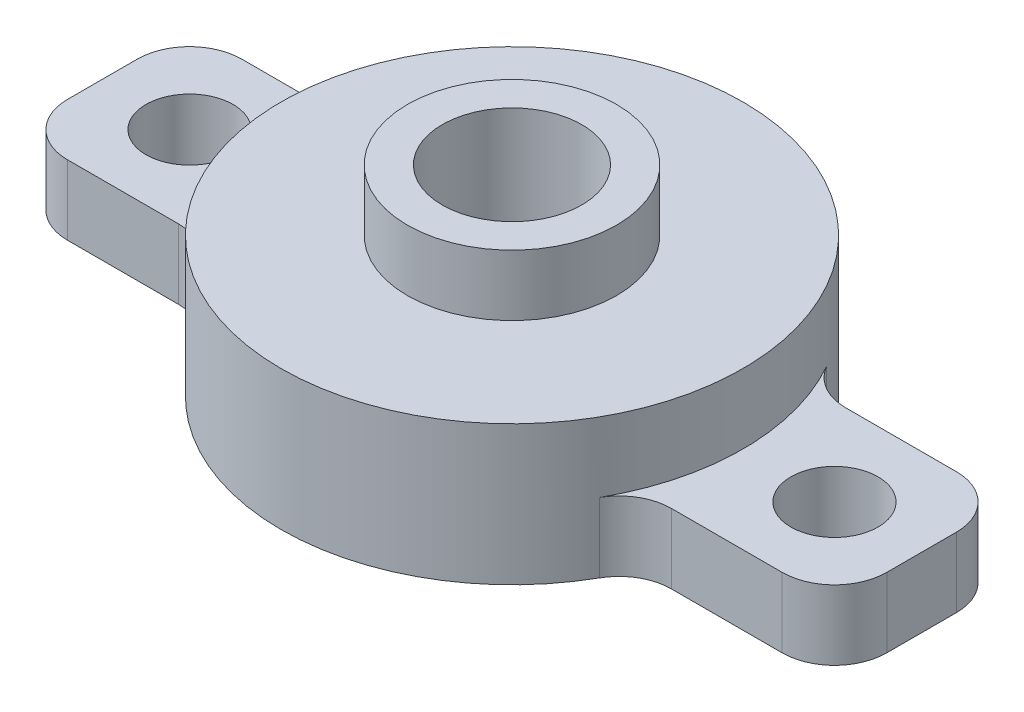
ISO-10303-21;
HEADER;
FILE_DESCRIPTION(('STEP AP214'),'2;1');
FILE_NAME('part.step','',(''),(''),'','','');
FILE_SCHEMA(('AUTOMOTIVE_DESIGN { 1 0 10303 214 1 1 1 1 }'));
ENDSEC;
DATA;
#1=APPLICATION_CONTEXT('core data for automotive mechanical design processes');
#2=APPLICATION_PROTOCOL_DEFINITION('international standard','automotive_design',2000,#1);
#3=PRODUCT_CONTEXT('',#1,'mechanical');
#4=PRODUCT('Part','Part','',(#3));
#5=PRODUCT_RELATED_PRODUCT_CATEGORY('part','',(#4));
#6=PRODUCT_DEFINITION_FORMATION('','',#4);
#7=PRODUCT_DEFINITION_CONTEXT('part definition',#1,'design');
#8=PRODUCT_DEFINITION('design','',#6,#7);
#9=PRODUCT_DEFINITION_SHAPE('','',#8);
#10=(LENGTH_UNIT() NAMED_UNIT(*) SI_UNIT(.MILLI.,.METRE.));
#11=(NAMED_UNIT(*) PLANE_ANGLE_UNIT() SI_UNIT($,.RADIAN.));
#12=(NAMED_UNIT(*) SI_UNIT($,.STERADIAN.) SOLID_ANGLE_UNIT());
#13=UNCERTAINTY_MEASURE_WITH_UNIT(LENGTH_MEASURE(1.E-05),#10,'distance_accuracy_value','');
#14=(GEOMETRIC_REPRESENTATION_CONTEXT(3) GLOBAL_UNCERTAINTY_ASSIGNED_CONTEXT((#13)) GLOBAL_UNIT_ASSIGNED_CONTEXT((#10,
#11,#12)) REPRESENTATION_CONTEXT('',''));
#15=CARTESIAN_POINT('',(0.,0.,0.));
#16=DIRECTION('',(0.,0.,1.));
#17=DIRECTION('',(1.,0.,0.));
#18=AXIS2_PLACEMENT_3D('',#15,#16,#17);
#19=CARTESIAN_POINT('',(0.,4.,0.));
#20=DIRECTION('',(0.,1.,0.));
#21=DIRECTION('',(0.,0.,1.));
#22=AXIS2_PLACEMENT_3D('',#19,#20,#21);
#23=PLANE('',#22);
#24=CARTESIAN_POINT('',(18.5,4.,0.));
#25=DIRECTION('',(0.,1.,0.));
#26=DIRECTION('',(0.,0.,1.));
#27=AXIS2_PLACEMENT_3D('',#24,#25,#26);
#28=CIRCLE('',#27,2.50000000000001);
#29=CARTESIAN_POINT('',(18.5,4.,2.50000000000001));
#30=VERTEX_POINT('',#29);
#31=EDGE_CURVE('E313',#30,#30,#28,.T.);
#32=ORIENTED_EDGE('',*,*,#31,.F.);
#33=EDGE_LOOP('',(#32));
#34=FACE_BOUND('',#33,.T.);
#35=DIRECTION('',(0.,0.,1.));
#36=VECTOR('',#35,1.);
#37=CARTESIAN_POINT('',(23.5,4.,0.));
#38=LINE('',#37,#36);
#39=CARTESIAN_POINT('',(23.5,4.,-2.));
#40=VERTEX_POINT('',#39);
#41=CARTESIAN_POINT('',(23.5,4.,2.));
#42=VERTEX_POINT('',#41);
#43=EDGE_CURVE('E269',#40,#42,#38,.T.);
#44=ORIENTED_EDGE('',*,*,#43,.F.);
#45=CARTESIAN_POINT('',(20.5,4.,-2.));
#46=DIRECTION('',(0.,1.,0.));
#47=DIRECTION('',(0.,0.,1.));
#48=AXIS2_PLACEMENT_3D('',#45,#46,#47);
#49=CIRCLE('',#48,3.);
#50=CARTESIAN_POINT('',(20.5,4.,-5.));
#51=VERTEX_POINT('',#50);
#52=EDGE_CURVE('E227',#40,#51,#49,.T.);
#53=ORIENTED_EDGE('',*,*,#52,.T.);
#54=DIRECTION('',(1.,0.,0.));
#55=VECTOR('',#54,1.);
#56=CARTESIAN_POINT('',(0.,4.,-5.));
#57=LINE('',#56,#55);
#58=CARTESIAN_POINT('',(14.1443451598156,4.,-5.));
#59=VERTEX_POINT('',#58);
#60=EDGE_CURVE('E266',#59,#51,#57,.T.);
#61=ORIENTED_EDGE('',*,*,#60,.F.);
#62=CARTESIAN_POINT('',(14.1443451598156,4.,-8.));
#63=DIRECTION('',(0.,1.,0.));
#64=DIRECTION('',(0.,0.,1.));
#65=AXIS2_PLACEMENT_3D('',#62,#63,#64);
#66=CIRCLE('',#65,3.);
#67=CARTESIAN_POINT('',(11.5330814380035,4.,-6.52307692307692));
#68=VERTEX_POINT('',#67);
#69=EDGE_CURVE('E11',#59,#68,#66,.F.);
#70=ORIENTED_EDGE('',*,*,#69,.T.);
#71=CARTESIAN_POINT('',(0.,4.,0.));
#72=DIRECTION('',(0.,1.,0.));
#73=DIRECTION('',(0.,0.,1.));
#74=AXIS2_PLACEMENT_3D('',#71,#72,#73);
#75=CIRCLE('',#74,13.25);
#76=CARTESIAN_POINT('',(11.5330814380035,4.,6.52307692307692));
#77=VERTEX_POINT('',#76);
#78=EDGE_CURVE('E265',#77,#68,#75,.T.);
#79=ORIENTED_EDGE('',*,*,#78,.F.);
#80=CARTESIAN_POINT('',(14.1443451598156,4.,8.));
#81=DIRECTION('',(0.,1.,0.));
#82=DIRECTION('',(0.,0.,1.));
#83=AXIS2_PLACEMENT_3D('',#80,#81,#82);
#84=CIRCLE('',#83,3.);
#85=CARTESIAN_POINT('',(14.1443451598156,4.,5.));
#86=VERTEX_POINT('',#85);
#87=EDGE_CURVE('E246',#77,#86,#84,.F.);
#88=ORIENTED_EDGE('',*,*,#87,.T.);
#89=DIRECTION('',(1.,0.,0.));
#90=VECTOR('',#89,1.);
#91=CARTESIAN_POINT('',(0.,4.,5.));
#92=LINE('',#91,#90);
#93=CARTESIAN_POINT('',(20.5,4.,5.));
#94=VERTEX_POINT('',#93);
#95=EDGE_CURVE('E274',#86,#94,#92,.T.);
#96=ORIENTED_EDGE('',*,*,#95,.T.);
#97=CARTESIAN_POINT('',(20.5,4.,2.));
#98=DIRECTION('',(0.,1.,0.));
#99=DIRECTION('',(0.,0.,1.));
#100=AXIS2_PLACEMENT_3D('',#97,#98,#99);
#101=CIRCLE('',#100,3.);
#102=EDGE_CURVE('E225',#94,#42,#101,.T.);
#103=ORIENTED_EDGE('',*,*,#102,.T.);
#104=EDGE_LOOP('',(#44,#53,#61,#70,#79,#88,#96,#103));
#105=FACE_BOUND('',#104,.T.);
#106=ADVANCED_FACE('F41',(#34,#105),#23,.T.);
#107=CARTESIAN_POINT('',(0.,4.,5.));
#108=DIRECTION('',(0.,0.,-1.));
#109=DIRECTION('',(-1.,0.,0.));
#110=AXIS2_PLACEMENT_3D('',#107,#108,#109);
#111=PLANE('',#110);
#112=ORIENTED_EDGE('',*,*,#95,.F.);
#113=DIRECTION('',(0.,1.,0.));
#114=VECTOR('',#113,1.);
#115=CARTESIAN_POINT('',(14.1443451598156,0.,5.));
#116=LINE('',#115,#114);
#117=CARTESIAN_POINT('',(14.1443451598156,0.,5.));
#118=VERTEX_POINT('',#117);
#119=EDGE_CURVE('E208',#86,#118,#116,.F.);
#120=ORIENTED_EDGE('',*,*,#119,.T.);
#121=DIRECTION('',(1.,0.,0.));
#122=VECTOR('',#121,1.);
#123=CARTESIAN_POINT('',(0.,0.,5.));
#124=LINE('',#123,#122);
#125=CARTESIAN_POINT('',(20.5,0.,5.));
#126=VERTEX_POINT('',#125);
#127=EDGE_CURVE('E285',#118,#126,#124,.T.);
#128=ORIENTED_EDGE('',*,*,#127,.T.);
#129=DIRECTION('',(0.,-1.,0.));
#130=VECTOR('',#129,1.);
#131=CARTESIAN_POINT('',(20.5,4.,5.));
#132=LINE('',#131,#130);
#133=EDGE_CURVE('E206',#126,#94,#132,.F.);
#134=ORIENTED_EDGE('',*,*,#133,.T.);
#135=EDGE_LOOP('',(#112,#120,#128,#134));
#136=FACE_BOUND('',#135,.T.);
#137=ADVANCED_FACE('F343',(#136),#111,.F.);
#138=CARTESIAN_POINT('',(23.5,4.,0.));
#139=DIRECTION('',(1.,0.,0.));
#140=DIRECTION('',(0.,0.,-1.));
#141=AXIS2_PLACEMENT_3D('',#138,#139,#140);
#142=PLANE('',#141);
#143=DIRECTION('',(0.,0.,1.));
#144=VECTOR('',#143,1.);
#145=CARTESIAN_POINT('',(23.5,0.,0.));
#146=LINE('',#145,#144);
#147=CARTESIAN_POINT('',(23.5,0.,-2.));
#148=VERTEX_POINT('',#147);
#149=CARTESIAN_POINT('',(23.5,0.,2.));
#150=VERTEX_POINT('',#149);
#151=EDGE_CURVE('E259',#148,#150,#146,.T.);
#152=ORIENTED_EDGE('',*,*,#151,.F.);
#153=DIRECTION('',(0.,-1.,0.));
#154=VECTOR('',#153,1.);
#155=CARTESIAN_POINT('',(23.5,4.,-2.));
#156=LINE('',#155,#154);
#157=EDGE_CURVE('E223',#148,#40,#156,.F.);
#158=ORIENTED_EDGE('',*,*,#157,.T.);
#159=ORIENTED_EDGE('',*,*,#43,.T.);
#160=DIRECTION('',(0.,-1.,0.));
#161=VECTOR('',#160,1.);
#162=CARTESIAN_POINT('',(23.5,0.,2.));
#163=LINE('',#162,#161);
#164=EDGE_CURVE('E220',#42,#150,#163,.T.);
#165=ORIENTED_EDGE('',*,*,#164,.T.);
#166=EDGE_LOOP('',(#152,#158,#159,#165));
#167=FACE_BOUND('',#166,.T.);
#168=ADVANCED_FACE('F351',(#167),#142,.T.);
#169=CARTESIAN_POINT('',(0.,4.,-5.));
#170=DIRECTION('',(0.,0.,-1.));
#171=DIRECTION('',(-1.,0.,0.));
#172=AXIS2_PLACEMENT_3D('',#169,#170,#171);
#173=PLANE('',#172);
#174=DIRECTION('',(1.,0.,0.));
#175=VECTOR('',#174,1.);
#176=CARTESIAN_POINT('',(0.,0.,-5.));
#177=LINE('',#176,#175);
#178=CARTESIAN_POINT('',(14.1443451598156,0.,-5.));
#179=VERTEX_POINT('',#178);
#180=CARTESIAN_POINT('',(20.5,0.,-5.));
#181=VERTEX_POINT('',#180);
#182=EDGE_CURVE('E249',#179,#181,#177,.T.);
#183=ORIENTED_EDGE('',*,*,#182,.F.);
#184=DIRECTION('',(0.,-1.,0.));
#185=VECTOR('',#184,1.);
#186=CARTESIAN_POINT('',(14.1443451598156,4.,-5.));
#187=LINE('',#186,#185);
#188=EDGE_CURVE('E214',#179,#59,#187,.F.);
#189=ORIENTED_EDGE('',*,*,#188,.T.);
#190=ORIENTED_EDGE('',*,*,#60,.T.);
#191=DIRECTION('',(0.,-1.,0.));
#192=VECTOR('',#191,1.);
#193=CARTESIAN_POINT('',(20.5,4.,-5.));
#194=LINE('',#193,#192);
#195=EDGE_CURVE('E211',#51,#181,#194,.T.);
#196=ORIENTED_EDGE('',*,*,#195,.T.);
#197=EDGE_LOOP('',(#183,#189,#190,#196));
#198=FACE_BOUND('',#197,.T.);
#199=ADVANCED_FACE('F255',(#198),#173,.T.);
#200=CARTESIAN_POINT('',(0.,4.,0.));
#201=DIRECTION('',(0.,-1.,0.));
#202=DIRECTION('',(0.,0.,-1.));
#203=AXIS2_PLACEMENT_3D('',#200,#201,#202);
#204=CYLINDRICAL_SURFACE('',#203,13.25);
#205=CARTESIAN_POINT('',(0.,0.,0.));
#206=DIRECTION('',(0.,1.,0.));
#207=DIRECTION('',(0.,0.,1.));
#208=AXIS2_PLACEMENT_3D('',#205,#206,#207);
#209=CIRCLE('',#208,13.25);
#210=CARTESIAN_POINT('',(11.5330814380035,0.,-6.52307692307692));
#211=VERTEX_POINT('',#210);
#212=CARTESIAN_POINT('',(-11.5330814380035,0.,-6.52307692307692));
#213=VERTEX_POINT('',#212);
#214=EDGE_CURVE('E176',#211,#213,#209,.T.);
#215=ORIENTED_EDGE('',*,*,#214,.T.);
#216=DIRECTION('',(0.,-1.,0.));
#217=VECTOR('',#216,1.);
#218=CARTESIAN_POINT('',(-11.5330814380035,4.,-6.52307692307692));
#219=LINE('',#218,#217);
#220=CARTESIAN_POINT('',(-11.5330814380035,4.,-6.52307692307692));
#221=VERTEX_POINT('',#220);
#222=EDGE_CURVE('E198',#213,#221,#219,.F.);
#223=ORIENTED_EDGE('',*,*,#222,.T.);
#224=CARTESIAN_POINT('',(-11.5330814380035,4.,6.52307692307692));
#225=VERTEX_POINT('',#224);
#226=EDGE_CURVE('E184',#221,#225,#75,.T.);
#227=ORIENTED_EDGE('',*,*,#226,.T.);
#228=DIRECTION('',(0.,-1.,0.));
#229=VECTOR('',#228,1.);
#230=CARTESIAN_POINT('',(-11.5330814380035,4.,6.52307692307692));
#231=LINE('',#230,#229);
#232=CARTESIAN_POINT('',(-11.5330814380035,0.,6.52307692307692));
#233=VERTEX_POINT('',#232);
#234=EDGE_CURVE('E195',#225,#233,#231,.T.);
#235=ORIENTED_EDGE('',*,*,#234,.T.);
#236=CARTESIAN_POINT('',(11.5330814380035,0.,6.52307692307692));
#237=VERTEX_POINT('',#236);
#238=EDGE_CURVE('E282',#233,#237,#209,.T.);
#239=ORIENTED_EDGE('',*,*,#238,.T.);
#240=DIRECTION('',(0.,-1.,0.));
#241=VECTOR('',#240,1.);
#242=CARTESIAN_POINT('',(11.5330814380035,4.,6.52307692307692));
#243=LINE('',#242,#241);
#244=EDGE_CURVE('E192',#237,#77,#243,.F.);
#245=ORIENTED_EDGE('',*,*,#244,.T.);
#246=ORIENTED_EDGE('',*,*,#78,.T.);
#247=DIRECTION('',(0.,-1.,0.));
#248=VECTOR('',#247,1.);
#249=CARTESIAN_POINT('',(11.5330814380035,4.,-6.52307692307692));
#250=LINE('',#249,#248);
#251=EDGE_CURVE('E181',#68,#211,#250,.T.);
#252=ORIENTED_EDGE('',*,*,#251,.T.);
#253=EDGE_LOOP('',(#215,#223,#227,#235,#239,#245,#246,#252));
#254=FACE_BOUND('',#253,.T.);
#255=CARTESIAN_POINT('',(0.,8.,0.));
#256=DIRECTION('',(0.,1.,0.));
#257=DIRECTION('',(0.,0.,1.));
#258=AXIS2_PLACEMENT_3D('',#255,#256,#257);
#259=CIRCLE('',#258,13.25);
#260=CARTESIAN_POINT('',(0.,8.,13.25));
#261=VERTEX_POINT('',#260);
#262=EDGE_CURVE('E286',#261,#261,#259,.T.);
#263=ORIENTED_EDGE('',*,*,#262,.F.);
#264=EDGE_LOOP('',(#263));
#265=FACE_BOUND('',#264,.T.);
#266=ADVANCED_FACE('F334',(#254,#265),#204,.T.);
#267=CARTESIAN_POINT('',(0.,4.,-5.));
#268=DIRECTION('',(0.,0.,-1.));
#269=DIRECTION('',(-1.,0.,0.));
#270=AXIS2_PLACEMENT_3D('',#267,#268,#269);
#271=PLANE('',#270);
#272=DIRECTION('',(1.,0.,0.));
#273=VECTOR('',#272,1.);
#274=CARTESIAN_POINT('',(0.,4.,-5.));
#275=LINE('',#274,#273);
#276=CARTESIAN_POINT('',(-20.5,4.,-5.));
#277=VERTEX_POINT('',#276);
#278=CARTESIAN_POINT('',(-14.1443451598156,4.,-5.));
#279=VERTEX_POINT('',#278);
#280=EDGE_CURVE('E268',#277,#279,#275,.T.);
#281=ORIENTED_EDGE('',*,*,#280,.T.);
#282=DIRECTION('',(0.,-1.,0.));
#283=VECTOR('',#282,1.);
#284=CARTESIAN_POINT('',(-14.1443451598156,4.,-5.));
#285=LINE('',#284,#283);
#286=CARTESIAN_POINT('',(-14.1443451598156,0.,-5.));
#287=VERTEX_POINT('',#286);
#288=EDGE_CURVE('E175',#279,#287,#285,.T.);
#289=ORIENTED_EDGE('',*,*,#288,.T.);
#290=DIRECTION('',(1.,0.,0.));
#291=VECTOR('',#290,1.);
#292=CARTESIAN_POINT('',(0.,0.,-5.));
#293=LINE('',#292,#291);
#294=CARTESIAN_POINT('',(-20.5,0.,-5.));
#295=VERTEX_POINT('',#294);
#296=EDGE_CURVE('E160',#295,#287,#293,.T.);
#297=ORIENTED_EDGE('',*,*,#296,.F.);
#298=DIRECTION('',(0.,-1.,0.));
#299=VECTOR('',#298,1.);
#300=CARTESIAN_POINT('',(-20.5,4.,-5.));
#301=LINE('',#300,#299);
#302=EDGE_CURVE('E173',#295,#277,#301,.F.);
#303=ORIENTED_EDGE('',*,*,#302,.T.);
#304=EDGE_LOOP('',(#281,#289,#297,#303));
#305=FACE_BOUND('',#304,.T.);
#306=ADVANCED_FACE('F172',(#305),#271,.T.);
#307=CARTESIAN_POINT('',(-23.5,4.,0.));
#308=DIRECTION('',(1.,0.,0.));
#309=DIRECTION('',(0.,0.,-1.));
#310=AXIS2_PLACEMENT_3D('',#307,#308,#309);
#311=PLANE('',#310);
#312=DIRECTION('',(0.,0.,1.));
#313=VECTOR('',#312,1.);
#314=CARTESIAN_POINT('',(-23.5,4.,0.));
#315=LINE('',#314,#313);
#316=CARTESIAN_POINT('',(-23.5,4.,-2.));
#317=VERTEX_POINT('',#316);
#318=CARTESIAN_POINT('',(-23.5,4.,2.));
#319=VERTEX_POINT('',#318);
#320=EDGE_CURVE('E271',#317,#319,#315,.T.);
#321=ORIENTED_EDGE('',*,*,#320,.F.);
#322=DIRECTION('',(0.,-1.,0.));
#323=VECTOR('',#322,1.);
#324=CARTESIAN_POINT('',(-23.5,0.,-2.));
#325=LINE('',#324,#323);
#326=CARTESIAN_POINT('',(-23.5,0.,-2.));
#327=VERTEX_POINT('',#326);
#328=EDGE_CURVE('E230',#317,#327,#325,.T.);
#329=ORIENTED_EDGE('',*,*,#328,.T.);
#330=DIRECTION('',(0.,0.,1.));
#331=VECTOR('',#330,1.);
#332=CARTESIAN_POINT('',(-23.5,0.,0.));
#333=LINE('',#332,#331);
#334=CARTESIAN_POINT('',(-23.5,0.,2.));
#335=VERTEX_POINT('',#334);
#336=EDGE_CURVE('E161',#327,#335,#333,.T.);
#337=ORIENTED_EDGE('',*,*,#336,.T.);
#338=DIRECTION('',(0.,-1.,0.));
#339=VECTOR('',#338,1.);
#340=CARTESIAN_POINT('',(-23.5,4.,2.));
#341=LINE('',#340,#339);
#342=EDGE_CURVE('E56',#335,#319,#341,.F.);
#343=ORIENTED_EDGE('',*,*,#342,.T.);
#344=EDGE_LOOP('',(#321,#329,#337,#343));
#345=FACE_BOUND('',#344,.T.);
#346=ADVANCED_FACE('F387',(#345),#311,.F.);
#347=CARTESIAN_POINT('',(0.,4.,5.));
#348=DIRECTION('',(0.,0.,-1.));
#349=DIRECTION('',(-1.,0.,0.));
#350=AXIS2_PLACEMENT_3D('',#347,#348,#349);
#351=PLANE('',#350);
#352=DIRECTION('',(1.,0.,0.));
#353=VECTOR('',#352,1.);
#354=CARTESIAN_POINT('',(0.,0.,5.));
#355=LINE('',#354,#353);
#356=CARTESIAN_POINT('',(-20.5,0.,5.));
#357=VERTEX_POINT('',#356);
#358=CARTESIAN_POINT('',(-14.1443451598156,0.,5.));
#359=VERTEX_POINT('',#358);
#360=EDGE_CURVE('E187',#357,#359,#355,.T.);
#361=ORIENTED_EDGE('',*,*,#360,.T.);
#362=DIRECTION('',(0.,1.,0.));
#363=VECTOR('',#362,1.);
#364=CARTESIAN_POINT('',(-14.1443451598156,4.,5.));
#365=LINE('',#364,#363);
#366=CARTESIAN_POINT('',(-14.1443451598156,4.,5.));
#367=VERTEX_POINT('',#366);
#368=EDGE_CURVE('E204',#359,#367,#365,.T.);
#369=ORIENTED_EDGE('',*,*,#368,.T.);
#370=DIRECTION('',(1.,0.,0.));
#371=VECTOR('',#370,1.);
#372=CARTESIAN_POINT('',(0.,4.,5.));
#373=LINE('',#372,#371);
#374=CARTESIAN_POINT('',(-20.5,4.,5.));
#375=VERTEX_POINT('',#374);
#376=EDGE_CURVE('E279',#375,#367,#373,.T.);
#377=ORIENTED_EDGE('',*,*,#376,.F.);
#378=DIRECTION('',(0.,-1.,0.));
#379=VECTOR('',#378,1.);
#380=CARTESIAN_POINT('',(-20.5,4.,5.));
#381=LINE('',#380,#379);
#382=EDGE_CURVE('E201',#375,#357,#381,.T.);
#383=ORIENTED_EDGE('',*,*,#382,.T.);
#384=EDGE_LOOP('',(#361,#369,#377,#383));
#385=FACE_BOUND('',#384,.T.);
#386=ADVANCED_FACE('F327',(#385),#351,.F.);
#387=CARTESIAN_POINT('',(-18.5,4.,0.));
#388=DIRECTION('',(0.,1.,0.));
#389=DIRECTION('',(0.,0.,1.));
#390=AXIS2_PLACEMENT_3D('',#387,#388,#389);
#391=CIRCLE('',#390,2.50000000000001);
#392=CARTESIAN_POINT('',(-18.5,4.,2.50000000000001));
#393=VERTEX_POINT('',#392);
#394=EDGE_CURVE('E319',#393,#393,#391,.T.);
#395=ORIENTED_EDGE('',*,*,#394,.F.);
#396=EDGE_LOOP('',(#395));
#397=FACE_BOUND('',#396,.T.);
#398=ORIENTED_EDGE('',*,*,#280,.F.);
#399=CARTESIAN_POINT('',(-20.5,4.,-2.));
#400=DIRECTION('',(0.,1.,0.));
#401=DIRECTION('',(0.,0.,1.));
#402=AXIS2_PLACEMENT_3D('',#399,#400,#401);
#403=CIRCLE('',#402,3.);
#404=EDGE_CURVE('E63',#277,#317,#403,.T.);
#405=ORIENTED_EDGE('',*,*,#404,.T.);
#406=ORIENTED_EDGE('',*,*,#320,.T.);
#407=CARTESIAN_POINT('',(-20.5,4.,2.));
#408=DIRECTION('',(0.,1.,0.));
#409=DIRECTION('',(0.,0.,1.));
#410=AXIS2_PLACEMENT_3D('',#407,#408,#409);
#411=CIRCLE('',#410,3.);
#412=EDGE_CURVE('E232',#319,#375,#411,.T.);
#413=ORIENTED_EDGE('',*,*,#412,.T.);
#414=ORIENTED_EDGE('',*,*,#376,.T.);
#415=CARTESIAN_POINT('',(-14.1443451598156,4.,8.));
#416=DIRECTION('',(0.,1.,0.));
#417=DIRECTION('',(0.,0.,1.));
#418=AXIS2_PLACEMENT_3D('',#415,#416,#417);
#419=CIRCLE('',#418,3.);
#420=EDGE_CURVE('E241',#367,#225,#419,.F.);
#421=ORIENTED_EDGE('',*,*,#420,.T.);
#422=ORIENTED_EDGE('',*,*,#226,.F.);
#423=CARTESIAN_POINT('',(-14.1443451598156,4.,-8.));
#424=DIRECTION('',(0.,1.,0.));
#425=DIRECTION('',(0.,0.,1.));
#426=AXIS2_PLACEMENT_3D('',#423,#424,#425);
#427=CIRCLE('',#426,3.);
#428=EDGE_CURVE('E237',#221,#279,#427,.F.);
#429=ORIENTED_EDGE('',*,*,#428,.T.);
#430=EDGE_LOOP('',(#398,#405,#406,#413,#414,#421,#422,#429));
#431=FACE_BOUND('',#430,.T.);
#432=ADVANCED_FACE('F325',(#397,#431),#23,.T.);
#433=CARTESIAN_POINT('',(0.,0.,0.));
#434=DIRECTION('',(0.,1.,0.));
#435=DIRECTION('',(0.,0.,1.));
#436=AXIS2_PLACEMENT_3D('',#433,#434,#435);
#437=PLANE('',#436);
#438=CARTESIAN_POINT('',(-18.5,0.,0.));
#439=DIRECTION('',(0.,1.,0.));
#440=DIRECTION('',(0.,0.,1.));
#441=AXIS2_PLACEMENT_3D('',#438,#439,#440);
#442=CIRCLE('',#441,2.50000000000001);
#443=CARTESIAN_POINT('',(-18.5,0.,2.50000000000001));
#444=VERTEX_POINT('',#443);
#445=EDGE_CURVE('E316',#444,#444,#442,.T.);
#446=ORIENTED_EDGE('',*,*,#445,.T.);
#447=EDGE_LOOP('',(#446));
#448=FACE_BOUND('',#447,.T.);
#449=CARTESIAN_POINT('',(18.5,0.,0.));
#450=DIRECTION('',(0.,1.,0.));
#451=DIRECTION('',(0.,0.,1.));
#452=AXIS2_PLACEMENT_3D('',#449,#450,#451);
#453=CIRCLE('',#452,2.50000000000001);
#454=CARTESIAN_POINT('',(18.5,0.,2.50000000000001));
#455=VERTEX_POINT('',#454);
#456=EDGE_CURVE('E310',#455,#455,#453,.T.);
#457=ORIENTED_EDGE('',*,*,#456,.T.);
#458=EDGE_LOOP('',(#457));
#459=FACE_BOUND('',#458,.T.);
#460=CARTESIAN_POINT('',(0.,0.,0.));
#461=DIRECTION('',(0.,1.,0.));
#462=DIRECTION('',(0.,0.,1.));
#463=AXIS2_PLACEMENT_3D('',#460,#461,#462);
#464=CIRCLE('',#463,4.);
#465=CARTESIAN_POINT('',(0.,0.,4.));
#466=VERTEX_POINT('',#465);
#467=EDGE_CURVE('E304',#466,#466,#464,.F.);
#468=ORIENTED_EDGE('',*,*,#467,.F.);
#469=EDGE_LOOP('',(#468));
#470=FACE_BOUND('',#469,.T.);
#471=ORIENTED_EDGE('',*,*,#182,.T.);
#472=CARTESIAN_POINT('',(20.5,0.,-2.));
#473=DIRECTION('',(0.,1.,0.));
#474=DIRECTION('',(0.,0.,1.));
#475=AXIS2_PLACEMENT_3D('',#472,#473,#474);
#476=CIRCLE('',#475,3.);
#477=EDGE_CURVE('E218',#181,#148,#476,.F.);
#478=ORIENTED_EDGE('',*,*,#477,.T.);
#479=ORIENTED_EDGE('',*,*,#151,.T.);
#480=CARTESIAN_POINT('',(20.5,0.,2.));
#481=DIRECTION('',(0.,1.,0.));
#482=DIRECTION('',(0.,0.,1.));
#483=AXIS2_PLACEMENT_3D('',#480,#481,#482);
#484=CIRCLE('',#483,3.);
#485=EDGE_CURVE('E166',#150,#126,#484,.F.);
#486=ORIENTED_EDGE('',*,*,#485,.T.);
#487=ORIENTED_EDGE('',*,*,#127,.F.);
#488=CARTESIAN_POINT('',(14.1443451598156,0.,8.));
#489=DIRECTION('',(0.,1.,0.));
#490=DIRECTION('',(0.,0.,1.));
#491=AXIS2_PLACEMENT_3D('',#488,#489,#490);
#492=CIRCLE('',#491,3.);
#493=EDGE_CURVE('E244',#118,#237,#492,.T.);
#494=ORIENTED_EDGE('',*,*,#493,.T.);
#495=ORIENTED_EDGE('',*,*,#238,.F.);
#496=CARTESIAN_POINT('',(-14.1443451598156,0.,8.));
#497=DIRECTION('',(0.,1.,0.));
#498=DIRECTION('',(0.,0.,1.));
#499=AXIS2_PLACEMENT_3D('',#496,#497,#498);
#500=CIRCLE('',#499,3.);
#501=EDGE_CURVE('E239',#233,#359,#500,.T.);
#502=ORIENTED_EDGE('',*,*,#501,.T.);
#503=ORIENTED_EDGE('',*,*,#360,.F.);
#504=CARTESIAN_POINT('',(-20.5,0.,2.));
#505=DIRECTION('',(0.,1.,0.));
#506=DIRECTION('',(0.,0.,1.));
#507=AXIS2_PLACEMENT_3D('',#504,#505,#506);
#508=CIRCLE('',#507,3.);
#509=EDGE_CURVE('E167',#357,#335,#508,.F.);
#510=ORIENTED_EDGE('',*,*,#509,.T.);
#511=ORIENTED_EDGE('',*,*,#336,.F.);
#512=CARTESIAN_POINT('',(-20.5,0.,-2.));
#513=DIRECTION('',(0.,1.,0.));
#514=DIRECTION('',(0.,0.,1.));
#515=AXIS2_PLACEMENT_3D('',#512,#513,#514);
#516=CIRCLE('',#515,3.);
#517=EDGE_CURVE('E156',#327,#295,#516,.F.);
#518=ORIENTED_EDGE('',*,*,#517,.T.);
#519=ORIENTED_EDGE('',*,*,#296,.T.);
#520=CARTESIAN_POINT('',(-14.1443451598156,0.,-8.));
#521=DIRECTION('',(0.,1.,0.));
#522=DIRECTION('',(0.,0.,1.));
#523=AXIS2_PLACEMENT_3D('',#520,#521,#522);
#524=CIRCLE('',#523,3.);
#525=EDGE_CURVE('E235',#287,#213,#524,.T.);
#526=ORIENTED_EDGE('',*,*,#525,.T.);
#527=ORIENTED_EDGE('',*,*,#214,.F.);
#528=CARTESIAN_POINT('',(14.1443451598156,0.,-8.));
#529=DIRECTION('',(0.,1.,0.));
#530=DIRECTION('',(0.,0.,1.));
#531=AXIS2_PLACEMENT_3D('',#528,#529,#530);
#532=CIRCLE('',#531,3.);
#533=EDGE_CURVE('E49',#211,#179,#532,.T.);
#534=ORIENTED_EDGE('',*,*,#533,.T.);
#535=EDGE_LOOP('',(#471,#478,#479,#486,#487,#494,#495,#502,#503,#510,#511,#518,#519,#526,#527,#534));
#536=FACE_BOUND('',#535,.T.);
#537=ADVANCED_FACE('F159',(#448,#459,#470,#536),#437,.F.);
#538=CARTESIAN_POINT('',(0.,8.,0.));
#539=DIRECTION('',(0.,1.,0.));
#540=DIRECTION('',(0.,0.,1.));
#541=AXIS2_PLACEMENT_3D('',#538,#539,#540);
#542=PLANE('',#541);
#543=CARTESIAN_POINT('',(0.,8.,0.));
#544=DIRECTION('',(0.,1.,0.));
#545=DIRECTION('',(0.,0.,1.));
#546=AXIS2_PLACEMENT_3D('',#543,#544,#545);
#547=CIRCLE('',#546,6.);
#548=CARTESIAN_POINT('',(0.,8.,6.));
#549=VERTEX_POINT('',#548);
#550=EDGE_CURVE('E179',#549,#549,#547,.T.);
#551=ORIENTED_EDGE('',*,*,#550,.F.);
#552=EDGE_LOOP('',(#551));
#553=FACE_BOUND('',#552,.T.);
#554=ORIENTED_EDGE('',*,*,#262,.T.);
#555=EDGE_LOOP('',(#554));
#556=FACE_BOUND('',#555,.T.);
#557=ADVANCED_FACE('F380',(#553,#556),#542,.T.);
#558=CARTESIAN_POINT('',(0.,11.5,0.));
#559=DIRECTION('',(0.,-1.,0.));
#560=DIRECTION('',(0.,0.,-1.));
#561=AXIS2_PLACEMENT_3D('',#558,#559,#560);
#562=CYLINDRICAL_SURFACE('',#561,6.);
#563=CARTESIAN_POINT('',(0.,11.5,0.));
#564=DIRECTION('',(0.,1.,0.));
#565=DIRECTION('',(0.,0.,1.));
#566=AXIS2_PLACEMENT_3D('',#563,#564,#565);
#567=CIRCLE('',#566,6.);
#568=CARTESIAN_POINT('',(0.,11.5,6.));
#569=VERTEX_POINT('',#568);
#570=EDGE_CURVE('E299',#569,#569,#567,.T.);
#571=ORIENTED_EDGE('',*,*,#570,.F.);
#572=EDGE_LOOP('',(#571));
#573=FACE_BOUND('',#572,.T.);
#574=ORIENTED_EDGE('',*,*,#550,.T.);
#575=EDGE_LOOP('',(#574));
#576=FACE_BOUND('',#575,.T.);
#577=ADVANCED_FACE('F449',(#573,#576),#562,.T.);
#578=CARTESIAN_POINT('',(0.,11.5,0.));
#579=DIRECTION('',(0.,1.,0.));
#580=DIRECTION('',(0.,0.,1.));
#581=AXIS2_PLACEMENT_3D('',#578,#579,#580);
#582=PLANE('',#581);
#583=CARTESIAN_POINT('',(0.,11.5,0.));
#584=DIRECTION('',(0.,1.,0.));
#585=DIRECTION('',(0.,0.,1.));
#586=AXIS2_PLACEMENT_3D('',#583,#584,#585);
#587=CIRCLE('',#586,4.);
#588=CARTESIAN_POINT('',(0.,11.5,4.));
#589=VERTEX_POINT('',#588);
#590=EDGE_CURVE('E307',#589,#589,#587,.T.);
#591=ORIENTED_EDGE('',*,*,#590,.F.);
#592=EDGE_LOOP('',(#591));
#593=FACE_BOUND('',#592,.T.);
#594=ORIENTED_EDGE('',*,*,#570,.T.);
#595=EDGE_LOOP('',(#594));
#596=FACE_BOUND('',#595,.T.);
#597=ADVANCED_FACE('F446',(#593,#596),#582,.T.);
#598=CARTESIAN_POINT('',(0.,-0.000999999999999265,0.));
#599=DIRECTION('',(0.,1.,0.));
#600=DIRECTION('',(0.,0.,1.));
#601=AXIS2_PLACEMENT_3D('',#598,#599,#600);
#602=CYLINDRICAL_SURFACE('',#601,4.);
#603=ORIENTED_EDGE('',*,*,#590,.T.);
#604=EDGE_LOOP('',(#603));
#605=FACE_BOUND('',#604,.T.);
#606=ORIENTED_EDGE('',*,*,#467,.T.);
#607=EDGE_LOOP('',(#606));
#608=FACE_BOUND('',#607,.T.);
#609=ADVANCED_FACE('F400',(#605,#608),#602,.F.);
#610=CARTESIAN_POINT('',(-14.1443451598156,4.,-8.));
#611=DIRECTION('',(0.,-1.,0.));
#612=DIRECTION('',(0.,0.,-1.));
#613=AXIS2_PLACEMENT_3D('',#610,#611,#612);
#614=CYLINDRICAL_SURFACE('',#613,3.);
#615=ORIENTED_EDGE('',*,*,#428,.F.);
#616=ORIENTED_EDGE('',*,*,#222,.F.);
#617=ORIENTED_EDGE('',*,*,#525,.F.);
#618=ORIENTED_EDGE('',*,*,#288,.F.);
#619=EDGE_LOOP('',(#615,#616,#617,#618));
#620=FACE_BOUND('',#619,.T.);
#621=ADVANCED_FACE('F331',(#620),#614,.F.);
#622=CARTESIAN_POINT('',(-14.1443451598156,4.,8.));
#623=DIRECTION('',(0.,-1.,0.));
#624=DIRECTION('',(0.,0.,-1.));
#625=AXIS2_PLACEMENT_3D('',#622,#623,#624);
#626=CYLINDRICAL_SURFACE('',#625,3.);
#627=ORIENTED_EDGE('',*,*,#420,.F.);
#628=ORIENTED_EDGE('',*,*,#368,.F.);
#629=ORIENTED_EDGE('',*,*,#501,.F.);
#630=ORIENTED_EDGE('',*,*,#234,.F.);
#631=EDGE_LOOP('',(#627,#628,#629,#630));
#632=FACE_BOUND('',#631,.T.);
#633=ADVANCED_FACE('F358',(#632),#626,.F.);
#634=CARTESIAN_POINT('',(14.1443451598156,4.,8.));
#635=DIRECTION('',(0.,-1.,0.));
#636=DIRECTION('',(0.,0.,-1.));
#637=AXIS2_PLACEMENT_3D('',#634,#635,#636);
#638=CYLINDRICAL_SURFACE('',#637,3.);
#639=ORIENTED_EDGE('',*,*,#87,.F.);
#640=ORIENTED_EDGE('',*,*,#244,.F.);
#641=ORIENTED_EDGE('',*,*,#493,.F.);
#642=ORIENTED_EDGE('',*,*,#119,.F.);
#643=EDGE_LOOP('',(#639,#640,#641,#642));
#644=FACE_BOUND('',#643,.T.);
#645=ADVANCED_FACE('F341',(#644),#638,.F.);
#646=CARTESIAN_POINT('',(14.1443451598156,4.,-8.));
#647=DIRECTION('',(0.,-1.,0.));
#648=DIRECTION('',(0.,0.,-1.));
#649=AXIS2_PLACEMENT_3D('',#646,#647,#648);
#650=CYLINDRICAL_SURFACE('',#649,3.);
#651=ORIENTED_EDGE('',*,*,#69,.F.);
#652=ORIENTED_EDGE('',*,*,#188,.F.);
#653=ORIENTED_EDGE('',*,*,#533,.F.);
#654=ORIENTED_EDGE('',*,*,#251,.F.);
#655=EDGE_LOOP('',(#651,#652,#653,#654));
#656=FACE_BOUND('',#655,.T.);
#657=ADVANCED_FACE('F262',(#656),#650,.F.);
#658=CARTESIAN_POINT('',(20.5,4.,-2.));
#659=DIRECTION('',(0.,-1.,0.));
#660=DIRECTION('',(0.,0.,-1.));
#661=AXIS2_PLACEMENT_3D('',#658,#659,#660);
#662=CYLINDRICAL_SURFACE('',#661,3.);
#663=ORIENTED_EDGE('',*,*,#52,.F.);
#664=ORIENTED_EDGE('',*,*,#157,.F.);
#665=ORIENTED_EDGE('',*,*,#477,.F.);
#666=ORIENTED_EDGE('',*,*,#195,.F.);
#667=EDGE_LOOP('',(#663,#664,#665,#666));
#668=FACE_BOUND('',#667,.T.);
#669=ADVANCED_FACE('F354',(#668),#662,.T.);
#670=CARTESIAN_POINT('',(20.5,4.,2.));
#671=DIRECTION('',(0.,1.,0.));
#672=DIRECTION('',(0.,0.,1.));
#673=AXIS2_PLACEMENT_3D('',#670,#671,#672);
#674=CYLINDRICAL_SURFACE('',#673,3.);
#675=ORIENTED_EDGE('',*,*,#102,.F.);
#676=ORIENTED_EDGE('',*,*,#133,.F.);
#677=ORIENTED_EDGE('',*,*,#485,.F.);
#678=ORIENTED_EDGE('',*,*,#164,.F.);
#679=EDGE_LOOP('',(#675,#676,#677,#678));
#680=FACE_BOUND('',#679,.T.);
#681=ADVANCED_FACE('F347',(#680),#674,.T.);
#682=CARTESIAN_POINT('',(-20.5,4.,-2.));
#683=DIRECTION('',(0.,1.,0.));
#684=DIRECTION('',(0.,0.,1.));
#685=AXIS2_PLACEMENT_3D('',#682,#683,#684);
#686=CYLINDRICAL_SURFACE('',#685,3.);
#687=ORIENTED_EDGE('',*,*,#404,.F.);
#688=ORIENTED_EDGE('',*,*,#302,.F.);
#689=ORIENTED_EDGE('',*,*,#517,.F.);
#690=ORIENTED_EDGE('',*,*,#328,.F.);
#691=EDGE_LOOP('',(#687,#688,#689,#690));
#692=FACE_BOUND('',#691,.T.);
#693=ADVANCED_FACE('F178',(#692),#686,.T.);
#694=CARTESIAN_POINT('',(-20.5,4.,2.));
#695=DIRECTION('',(0.,-1.,0.));
#696=DIRECTION('',(0.,0.,-1.));
#697=AXIS2_PLACEMENT_3D('',#694,#695,#696);
#698=CYLINDRICAL_SURFACE('',#697,3.);
#699=ORIENTED_EDGE('',*,*,#412,.F.);
#700=ORIENTED_EDGE('',*,*,#342,.F.);
#701=ORIENTED_EDGE('',*,*,#509,.F.);
#702=ORIENTED_EDGE('',*,*,#382,.F.);
#703=EDGE_LOOP('',(#699,#700,#701,#702));
#704=FACE_BOUND('',#703,.T.);
#705=ADVANCED_FACE('F43',(#704),#698,.T.);
#706=CARTESIAN_POINT('',(18.5,4.,0.));
#707=DIRECTION('',(0.,1.,0.));
#708=DIRECTION('',(0.,0.,1.));
#709=AXIS2_PLACEMENT_3D('',#706,#707,#708);
#710=CYLINDRICAL_SURFACE('',#709,2.50000000000001);
#711=ORIENTED_EDGE('',*,*,#456,.F.);
#712=EDGE_LOOP('',(#711));
#713=FACE_BOUND('',#712,.T.);
#714=ORIENTED_EDGE('',*,*,#31,.T.);
#715=EDGE_LOOP('',(#714));
#716=FACE_BOUND('',#715,.T.);
#717=ADVANCED_FACE('F364',(#713,#716),#710,.F.);
#718=CARTESIAN_POINT('',(-18.5,4.,0.));
#719=DIRECTION('',(0.,1.,0.));
#720=DIRECTION('',(0.,0.,1.));
#721=AXIS2_PLACEMENT_3D('',#718,#719,#720);
#722=CYLINDRICAL_SURFACE('',#721,2.50000000000001);
#723=ORIENTED_EDGE('',*,*,#445,.F.);
#724=EDGE_LOOP('',(#723));
#725=FACE_BOUND('',#724,.T.);
#726=ORIENTED_EDGE('',*,*,#394,.T.);
#727=EDGE_LOOP('',(#726));
#728=FACE_BOUND('',#727,.T.);
#729=ADVANCED_FACE('F323',(#725,#728),#722,.F.);
#730=CLOSED_SHELL('',(#106,#137,#168,#199,#266,#306,#346,#386,#432,#537,#557,#577,#597,#609,
#621,#633,#645,#657,#669,#681,#693,#705,#717,#729));
#731=MANIFOLD_SOLID_BREP('B2',#730);
#732=ADVANCED_BREP_SHAPE_REPRESENTATION('',(#18,#731),#14);
#733=SHAPE_DEFINITION_REPRESENTATION(#9,#732);
ENDSEC;
END-ISO-10303-21;
